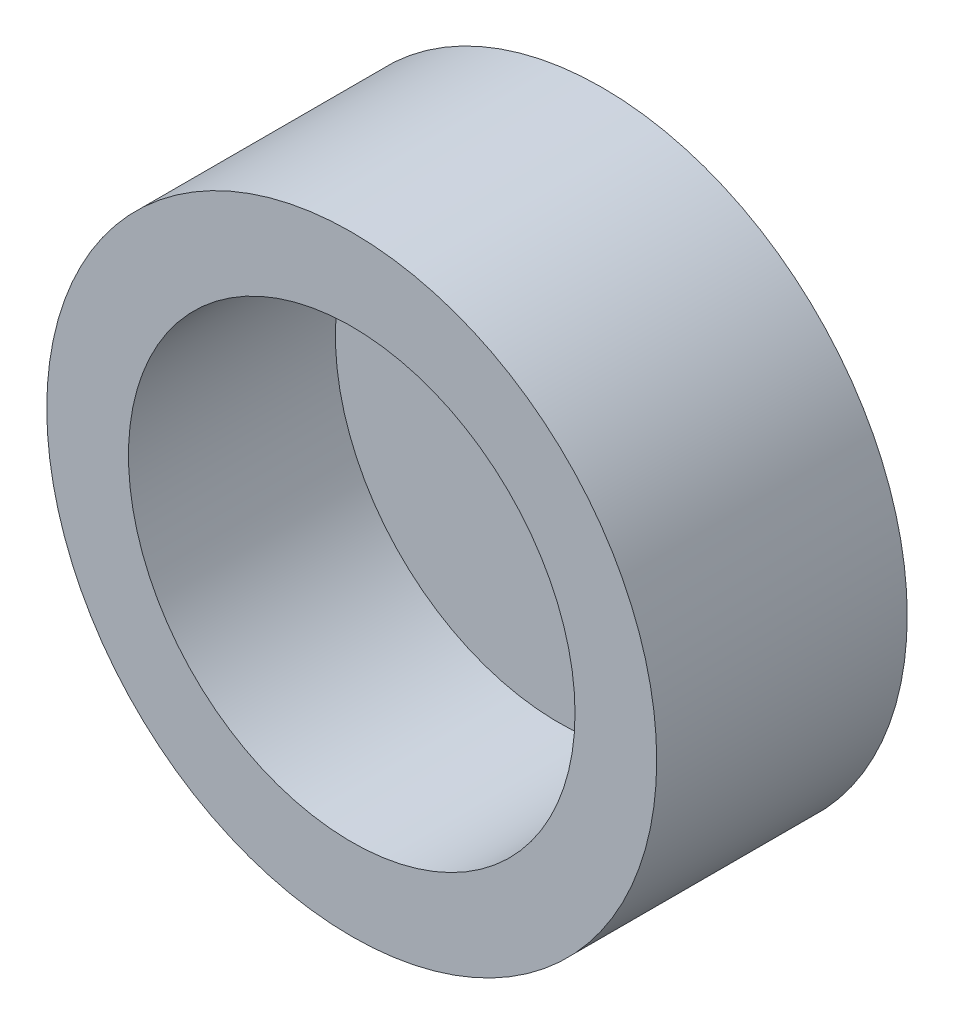
ISO-10303-21;
HEADER;
FILE_DESCRIPTION(('STEP AP214'),'2;1');
FILE_NAME('part.step','',(''),(''),'','','');
FILE_SCHEMA(('AUTOMOTIVE_DESIGN { 1 0 10303 214 1 1 1 1 }'));
ENDSEC;
DATA;
#1=APPLICATION_CONTEXT('core data for automotive mechanical design processes');
#2=APPLICATION_PROTOCOL_DEFINITION('international standard','automotive_design',2000,#1);
#3=PRODUCT_CONTEXT('',#1,'mechanical');
#4=PRODUCT('Part','Part','',(#3));
#5=PRODUCT_RELATED_PRODUCT_CATEGORY('part','',(#4));
#6=PRODUCT_DEFINITION_FORMATION('','',#4);
#7=PRODUCT_DEFINITION_CONTEXT('part definition',#1,'design');
#8=PRODUCT_DEFINITION('design','',#6,#7);
#9=PRODUCT_DEFINITION_SHAPE('','',#8);
#10=(LENGTH_UNIT() NAMED_UNIT(*) SI_UNIT(.MILLI.,.METRE.));
#11=(NAMED_UNIT(*) PLANE_ANGLE_UNIT() SI_UNIT($,.RADIAN.));
#12=(NAMED_UNIT(*) SI_UNIT($,.STERADIAN.) SOLID_ANGLE_UNIT());
#13=UNCERTAINTY_MEASURE_WITH_UNIT(LENGTH_MEASURE(1.E-05),#10,'distance_accuracy_value','');
#14=(GEOMETRIC_REPRESENTATION_CONTEXT(3) GLOBAL_UNCERTAINTY_ASSIGNED_CONTEXT((#13)) GLOBAL_UNIT_ASSIGNED_CONTEXT((#10,
#11,#12)) REPRESENTATION_CONTEXT('',''));
#15=CARTESIAN_POINT('',(0.,0.,0.));
#16=DIRECTION('',(0.,0.,1.));
#17=DIRECTION('',(1.,0.,0.));
#18=AXIS2_PLACEMENT_3D('',#15,#16,#17);
#19=CARTESIAN_POINT('',(0.,0.,23.));
#20=DIRECTION('',(0.,0.,-1.));
#21=DIRECTION('',(-1.,0.,0.));
#22=AXIS2_PLACEMENT_3D('',#19,#20,#21);
#23=CYLINDRICAL_SURFACE('',#22,56.);
#24=CARTESIAN_POINT('',(0.,0.,23.));
#25=DIRECTION('',(0.,0.,1.));
#26=DIRECTION('',(1.,0.,0.));
#27=AXIS2_PLACEMENT_3D('',#24,#25,#26);
#28=CIRCLE('',#27,56.);
#29=CARTESIAN_POINT('',(56.,0.,23.));
#30=VERTEX_POINT('',#29);
#31=EDGE_CURVE('E10',#30,#30,#28,.T.);
#32=ORIENTED_EDGE('',*,*,#31,.F.);
#33=EDGE_LOOP('',(#32));
#34=FACE_BOUND('',#33,.T.);
#35=CARTESIAN_POINT('',(0.,0.,-23.));
#36=DIRECTION('',(0.,0.,1.));
#37=DIRECTION('',(1.,0.,0.));
#38=AXIS2_PLACEMENT_3D('',#35,#36,#37);
#39=CIRCLE('',#38,56.);
#40=CARTESIAN_POINT('',(56.,0.,-23.));
#41=VERTEX_POINT('',#40);
#42=EDGE_CURVE('E46',#41,#41,#39,.T.);
#43=ORIENTED_EDGE('',*,*,#42,.T.);
#44=EDGE_LOOP('',(#43));
#45=FACE_BOUND('',#44,.T.);
#46=ADVANCED_FACE('F43',(#34,#45),#23,.T.);
#47=CARTESIAN_POINT('',(0.,0.,23.));
#48=DIRECTION('',(0.,0.,1.));
#49=DIRECTION('',(1.,0.,0.));
#50=AXIS2_PLACEMENT_3D('',#47,#48,#49);
#51=PLANE('',#50);
#52=CARTESIAN_POINT('',(0.,0.,23.));
#53=DIRECTION('',(0.,0.,1.));
#54=DIRECTION('',(1.,0.,0.));
#55=AXIS2_PLACEMENT_3D('',#52,#53,#54);
#56=CIRCLE('',#55,41.);
#57=CARTESIAN_POINT('',(41.,0.,23.));
#58=VERTEX_POINT('',#57);
#59=EDGE_CURVE('E60',#58,#58,#56,.T.);
#60=ORIENTED_EDGE('',*,*,#59,.F.);
#61=EDGE_LOOP('',(#60));
#62=FACE_BOUND('',#61,.T.);
#63=ORIENTED_EDGE('',*,*,#31,.T.);
#64=EDGE_LOOP('',(#63));
#65=FACE_BOUND('',#64,.T.);
#66=ADVANCED_FACE('F74',(#62,#65),#51,.T.);
#67=CARTESIAN_POINT('',(0.,0.,-23.));
#68=DIRECTION('',(0.,0.,1.));
#69=DIRECTION('',(1.,0.,0.));
#70=AXIS2_PLACEMENT_3D('',#67,#68,#69);
#71=PLANE('',#70);
#72=ORIENTED_EDGE('',*,*,#42,.F.);
#73=EDGE_LOOP('',(#72));
#74=FACE_BOUND('',#73,.T.);
#75=ADVANCED_FACE('F68',(#74),#71,.F.);
#76=CARTESIAN_POINT('',(0.,0.,-15.));
#77=DIRECTION('',(0.,0.,1.));
#78=DIRECTION('',(1.,0.,0.));
#79=AXIS2_PLACEMENT_3D('',#76,#77,#78);
#80=CYLINDRICAL_SURFACE('',#79,41.);
#81=CARTESIAN_POINT('',(0.,0.,-15.));
#82=DIRECTION('',(0.,0.,1.));
#83=DIRECTION('',(1.,0.,0.));
#84=AXIS2_PLACEMENT_3D('',#81,#82,#83);
#85=CIRCLE('',#84,41.);
#86=CARTESIAN_POINT('',(41.,0.,-15.));
#87=VERTEX_POINT('',#86);
#88=EDGE_CURVE('E54',#87,#87,#85,.T.);
#89=ORIENTED_EDGE('',*,*,#88,.F.);
#90=EDGE_LOOP('',(#89));
#91=FACE_BOUND('',#90,.T.);
#92=ORIENTED_EDGE('',*,*,#59,.T.);
#93=EDGE_LOOP('',(#92));
#94=FACE_BOUND('',#93,.T.);
#95=ADVANCED_FACE('F70',(#91,#94),#80,.F.);
#96=CARTESIAN_POINT('',(0.,0.,-15.));
#97=DIRECTION('',(0.,0.,1.));
#98=DIRECTION('',(1.,0.,0.));
#99=AXIS2_PLACEMENT_3D('',#96,#97,#98);
#100=PLANE('',#99);
#101=ORIENTED_EDGE('',*,*,#88,.T.);
#102=EDGE_LOOP('',(#101));
#103=FACE_BOUND('',#102,.T.);
#104=ADVANCED_FACE('F63',(#103),#100,.T.);
#105=CLOSED_SHELL('',(#46,#66,#75,#95,#104));
#106=MANIFOLD_SOLID_BREP('B2',#105);
#107=ADVANCED_BREP_SHAPE_REPRESENTATION('',(#18,#106),#14);
#108=SHAPE_DEFINITION_REPRESENTATION(#9,#107);
ENDSEC;
END-ISO-10303-21;
